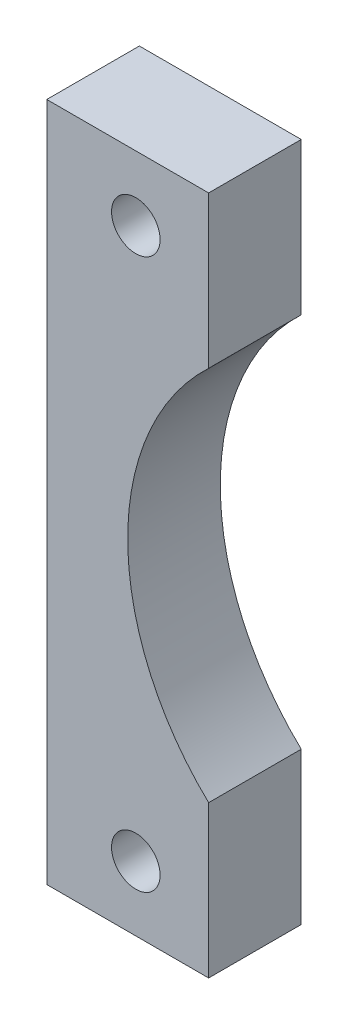
ISO-10303-21;
HEADER;
FILE_DESCRIPTION(('STEP AP214'),'2;1');
FILE_NAME('part.step','',(''),(''),'','','');
FILE_SCHEMA(('AUTOMOTIVE_DESIGN { 1 0 10303 214 1 1 1 1 }'));
ENDSEC;
DATA;
#1=APPLICATION_CONTEXT('core data for automotive mechanical design processes');
#2=APPLICATION_PROTOCOL_DEFINITION('international standard','automotive_design',2000,#1);
#3=PRODUCT_CONTEXT('',#1,'mechanical');
#4=PRODUCT('Part','Part','',(#3));
#5=PRODUCT_RELATED_PRODUCT_CATEGORY('part','',(#4));
#6=PRODUCT_DEFINITION_FORMATION('','',#4);
#7=PRODUCT_DEFINITION_CONTEXT('part definition',#1,'design');
#8=PRODUCT_DEFINITION('design','',#6,#7);
#9=PRODUCT_DEFINITION_SHAPE('','',#8);
#10=(LENGTH_UNIT() NAMED_UNIT(*) SI_UNIT(.MILLI.,.METRE.));
#11=(NAMED_UNIT(*) PLANE_ANGLE_UNIT() SI_UNIT($,.RADIAN.));
#12=(NAMED_UNIT(*) SI_UNIT($,.STERADIAN.) SOLID_ANGLE_UNIT());
#13=UNCERTAINTY_MEASURE_WITH_UNIT(LENGTH_MEASURE(1.E-05),#10,'distance_accuracy_value','');
#14=(GEOMETRIC_REPRESENTATION_CONTEXT(3) GLOBAL_UNCERTAINTY_ASSIGNED_CONTEXT((#13)) GLOBAL_UNIT_ASSIGNED_CONTEXT((#10,
#11,#12)) REPRESENTATION_CONTEXT('',''));
#15=CARTESIAN_POINT('',(0.,0.,0.));
#16=DIRECTION('',(0.,0.,1.));
#17=DIRECTION('',(1.,0.,0.));
#18=AXIS2_PLACEMENT_3D('',#15,#16,#17);
#19=CARTESIAN_POINT('',(21.,-21.,5.72));
#20=DIRECTION('',(0.,0.,1.));
#21=DIRECTION('',(1.,0.,0.));
#22=AXIS2_PLACEMENT_3D('',#19,#20,#21);
#23=PLANE('',#22);
#24=CARTESIAN_POINT('',(5.50000000000001,-38.,5.72));
#25=DIRECTION('',(0.,0.,1.));
#26=DIRECTION('',(1.,0.,0.));
#27=AXIS2_PLACEMENT_3D('',#24,#25,#26);
#28=CIRCLE('',#27,1.5);
#29=CARTESIAN_POINT('',(7.00000000000001,-38.,5.72));
#30=VERTEX_POINT('',#29);
#31=EDGE_CURVE('E122',#30,#30,#28,.T.);
#32=ORIENTED_EDGE('',*,*,#31,.F.);
#33=EDGE_LOOP('',(#32));
#34=FACE_BOUND('',#33,.T.);
#35=DIRECTION('',(0.,-1.,0.));
#36=VECTOR('',#35,1.);
#37=CARTESIAN_POINT('',(0.,0.,5.72));
#38=LINE('',#37,#36);
#39=CARTESIAN_POINT('',(0.,0.,5.72));
#40=VERTEX_POINT('',#39);
#41=CARTESIAN_POINT('',(0.,-42.,5.72));
#42=VERTEX_POINT('',#41);
#43=EDGE_CURVE('E129',#40,#42,#38,.T.);
#44=ORIENTED_EDGE('',*,*,#43,.T.);
#45=DIRECTION('',(1.,0.,0.));
#46=VECTOR('',#45,1.);
#47=CARTESIAN_POINT('',(0.,-42.,5.72));
#48=LINE('',#47,#46);
#49=CARTESIAN_POINT('',(10.,-42.,5.72));
#50=VERTEX_POINT('',#49);
#51=EDGE_CURVE('E87',#42,#50,#48,.T.);
#52=ORIENTED_EDGE('',*,*,#51,.T.);
#53=DIRECTION('',(0.,1.,0.));
#54=VECTOR('',#53,1.);
#55=CARTESIAN_POINT('',(10.,-42.,5.72));
#56=LINE('',#55,#54);
#57=CARTESIAN_POINT('',(10.,-32.6189500386223,5.72));
#58=VERTEX_POINT('',#57);
#59=EDGE_CURVE('E100',#50,#58,#56,.T.);
#60=ORIENTED_EDGE('',*,*,#59,.T.);
#61=CARTESIAN_POINT('',(21.,-21.,5.72));
#62=DIRECTION('',(0.,0.,-1.));
#63=DIRECTION('',(1.,0.,0.));
#64=AXIS2_PLACEMENT_3D('',#61,#62,#63);
#65=CIRCLE('',#64,16.);
#66=CARTESIAN_POINT('',(10.,-9.38104996137775,5.72));
#67=VERTEX_POINT('',#66);
#68=EDGE_CURVE('E94',#58,#67,#65,.T.);
#69=ORIENTED_EDGE('',*,*,#68,.T.);
#70=DIRECTION('',(0.,1.,0.));
#71=VECTOR('',#70,1.);
#72=CARTESIAN_POINT('',(10.,0.,5.72));
#73=LINE('',#72,#71);
#74=CARTESIAN_POINT('',(10.,0.,5.72));
#75=VERTEX_POINT('',#74);
#76=EDGE_CURVE('E98',#67,#75,#73,.T.);
#77=ORIENTED_EDGE('',*,*,#76,.T.);
#78=DIRECTION('',(-1.,0.,0.));
#79=VECTOR('',#78,1.);
#80=CARTESIAN_POINT('',(0.,0.,5.72));
#81=LINE('',#80,#79);
#82=EDGE_CURVE('E50',#75,#40,#81,.T.);
#83=ORIENTED_EDGE('',*,*,#82,.T.);
#84=EDGE_LOOP('',(#44,#52,#60,#69,#77,#83));
#85=FACE_BOUND('',#84,.T.);
#86=CARTESIAN_POINT('',(5.5,-4.,5.72));
#87=DIRECTION('',(0.,0.,1.));
#88=DIRECTION('',(1.,0.,0.));
#89=AXIS2_PLACEMENT_3D('',#86,#87,#88);
#90=CIRCLE('',#89,1.5);
#91=CARTESIAN_POINT('',(7.,-4.,5.72));
#92=VERTEX_POINT('',#91);
#93=EDGE_CURVE('E171',#92,#92,#90,.T.);
#94=ORIENTED_EDGE('',*,*,#93,.F.);
#95=EDGE_LOOP('',(#94));
#96=FACE_BOUND('',#95,.T.);
#97=ADVANCED_FACE('F33',(#34,#85,#96),#23,.T.);
#98=CARTESIAN_POINT('',(21.,-21.,0.));
#99=DIRECTION('',(0.,0.,1.));
#100=DIRECTION('',(1.,0.,0.));
#101=AXIS2_PLACEMENT_3D('',#98,#99,#100);
#102=PLANE('',#101);
#103=DIRECTION('',(0.,-1.,0.));
#104=VECTOR('',#103,1.);
#105=CARTESIAN_POINT('',(0.,0.,0.));
#106=LINE('',#105,#104);
#107=CARTESIAN_POINT('',(0.,0.,0.));
#108=VERTEX_POINT('',#107);
#109=CARTESIAN_POINT('',(0.,-42.,0.));
#110=VERTEX_POINT('',#109);
#111=EDGE_CURVE('E118',#108,#110,#106,.T.);
#112=ORIENTED_EDGE('',*,*,#111,.F.);
#113=DIRECTION('',(-1.,0.,0.));
#114=VECTOR('',#113,1.);
#115=CARTESIAN_POINT('',(0.,0.,0.));
#116=LINE('',#115,#114);
#117=CARTESIAN_POINT('',(10.,0.,0.));
#118=VERTEX_POINT('',#117);
#119=EDGE_CURVE('E79',#118,#108,#116,.T.);
#120=ORIENTED_EDGE('',*,*,#119,.F.);
#121=DIRECTION('',(0.,1.,0.));
#122=VECTOR('',#121,1.);
#123=CARTESIAN_POINT('',(10.,0.,0.));
#124=LINE('',#123,#122);
#125=CARTESIAN_POINT('',(10.,-9.38104996137775,0.));
#126=VERTEX_POINT('',#125);
#127=EDGE_CURVE('E73',#126,#118,#124,.T.);
#128=ORIENTED_EDGE('',*,*,#127,.F.);
#129=CARTESIAN_POINT('',(21.,-21.,0.));
#130=DIRECTION('',(0.,0.,-1.));
#131=DIRECTION('',(1.,0.,0.));
#132=AXIS2_PLACEMENT_3D('',#129,#130,#131);
#133=CIRCLE('',#132,16.);
#134=CARTESIAN_POINT('',(10.,-32.6189500386223,0.));
#135=VERTEX_POINT('',#134);
#136=EDGE_CURVE('E108',#135,#126,#133,.T.);
#137=ORIENTED_EDGE('',*,*,#136,.F.);
#138=DIRECTION('',(0.,1.,0.));
#139=VECTOR('',#138,1.);
#140=CARTESIAN_POINT('',(10.,-42.,0.));
#141=LINE('',#140,#139);
#142=CARTESIAN_POINT('',(10.,-42.,0.));
#143=VERTEX_POINT('',#142);
#144=EDGE_CURVE('E124',#143,#135,#141,.T.);
#145=ORIENTED_EDGE('',*,*,#144,.F.);
#146=DIRECTION('',(1.,0.,0.));
#147=VECTOR('',#146,1.);
#148=CARTESIAN_POINT('',(0.,-42.,0.));
#149=LINE('',#148,#147);
#150=EDGE_CURVE('E121',#110,#143,#149,.T.);
#151=ORIENTED_EDGE('',*,*,#150,.F.);
#152=EDGE_LOOP('',(#112,#120,#128,#137,#145,#151));
#153=FACE_BOUND('',#152,.T.);
#154=CARTESIAN_POINT('',(5.50000000000001,-38.,0.));
#155=DIRECTION('',(0.,0.,1.));
#156=DIRECTION('',(1.,0.,0.));
#157=AXIS2_PLACEMENT_3D('',#154,#155,#156);
#158=CIRCLE('',#157,1.5);
#159=CARTESIAN_POINT('',(7.00000000000001,-38.,0.));
#160=VERTEX_POINT('',#159);
#161=EDGE_CURVE('E177',#160,#160,#158,.T.);
#162=ORIENTED_EDGE('',*,*,#161,.T.);
#163=EDGE_LOOP('',(#162));
#164=FACE_BOUND('',#163,.T.);
#165=CARTESIAN_POINT('',(5.5,-4.,0.));
#166=DIRECTION('',(0.,0.,1.));
#167=DIRECTION('',(1.,0.,0.));
#168=AXIS2_PLACEMENT_3D('',#165,#166,#167);
#169=CIRCLE('',#168,1.5);
#170=CARTESIAN_POINT('',(7.,-4.,0.));
#171=VERTEX_POINT('',#170);
#172=EDGE_CURVE('E174',#171,#171,#169,.T.);
#173=ORIENTED_EDGE('',*,*,#172,.T.);
#174=EDGE_LOOP('',(#173));
#175=FACE_BOUND('',#174,.T.);
#176=ADVANCED_FACE('F138',(#153,#164,#175),#102,.F.);
#177=CARTESIAN_POINT('',(0.,0.,5.72));
#178=DIRECTION('',(1.,0.,0.));
#179=DIRECTION('',(0.,1.,0.));
#180=AXIS2_PLACEMENT_3D('',#177,#178,#179);
#181=PLANE('',#180);
#182=ORIENTED_EDGE('',*,*,#111,.T.);
#183=DIRECTION('',(0.,0.,-1.));
#184=VECTOR('',#183,1.);
#185=CARTESIAN_POINT('',(0.,-42.,5.72));
#186=LINE('',#185,#184);
#187=EDGE_CURVE('E11',#42,#110,#186,.T.);
#188=ORIENTED_EDGE('',*,*,#187,.F.);
#189=ORIENTED_EDGE('',*,*,#43,.F.);
#190=DIRECTION('',(0.,0.,-1.));
#191=VECTOR('',#190,1.);
#192=CARTESIAN_POINT('',(0.,0.,5.72));
#193=LINE('',#192,#191);
#194=EDGE_CURVE('E114',#40,#108,#193,.T.);
#195=ORIENTED_EDGE('',*,*,#194,.T.);
#196=EDGE_LOOP('',(#182,#188,#189,#195));
#197=FACE_BOUND('',#196,.T.);
#198=ADVANCED_FACE('F35',(#197),#181,.F.);
#199=CARTESIAN_POINT('',(0.,-42.,5.72));
#200=DIRECTION('',(0.,1.,0.));
#201=DIRECTION('',(0.,0.,1.));
#202=AXIS2_PLACEMENT_3D('',#199,#200,#201);
#203=PLANE('',#202);
#204=ORIENTED_EDGE('',*,*,#150,.T.);
#205=DIRECTION('',(0.,0.,-1.));
#206=VECTOR('',#205,1.);
#207=CARTESIAN_POINT('',(10.,-42.,5.72));
#208=LINE('',#207,#206);
#209=EDGE_CURVE('E42',#50,#143,#208,.T.);
#210=ORIENTED_EDGE('',*,*,#209,.F.);
#211=ORIENTED_EDGE('',*,*,#51,.F.);
#212=ORIENTED_EDGE('',*,*,#187,.T.);
#213=EDGE_LOOP('',(#204,#210,#211,#212));
#214=FACE_BOUND('',#213,.T.);
#215=ADVANCED_FACE('F218',(#214),#203,.F.);
#216=CARTESIAN_POINT('',(10.,-42.,5.72));
#217=DIRECTION('',(-1.,0.,0.));
#218=DIRECTION('',(0.,0.,1.));
#219=AXIS2_PLACEMENT_3D('',#216,#217,#218);
#220=PLANE('',#219);
#221=ORIENTED_EDGE('',*,*,#144,.T.);
#222=DIRECTION('',(0.,0.,-1.));
#223=VECTOR('',#222,1.);
#224=CARTESIAN_POINT('',(10.,-32.6189500386223,5.72));
#225=LINE('',#224,#223);
#226=EDGE_CURVE('E109',#58,#135,#225,.T.);
#227=ORIENTED_EDGE('',*,*,#226,.F.);
#228=ORIENTED_EDGE('',*,*,#59,.F.);
#229=ORIENTED_EDGE('',*,*,#209,.T.);
#230=EDGE_LOOP('',(#221,#227,#228,#229));
#231=FACE_BOUND('',#230,.T.);
#232=ADVANCED_FACE('F135',(#231),#220,.F.);
#233=CARTESIAN_POINT('',(21.,-21.,5.72));
#234=DIRECTION('',(0.,0.,-1.));
#235=DIRECTION('',(-1.,0.,0.));
#236=AXIS2_PLACEMENT_3D('',#233,#234,#235);
#237=CYLINDRICAL_SURFACE('',#236,16.);
#238=ORIENTED_EDGE('',*,*,#136,.T.);
#239=DIRECTION('',(0.,0.,-1.));
#240=VECTOR('',#239,1.);
#241=CARTESIAN_POINT('',(10.,-9.38104996137775,5.72));
#242=LINE('',#241,#240);
#243=EDGE_CURVE('E105',#67,#126,#242,.T.);
#244=ORIENTED_EDGE('',*,*,#243,.F.);
#245=ORIENTED_EDGE('',*,*,#68,.F.);
#246=ORIENTED_EDGE('',*,*,#226,.T.);
#247=EDGE_LOOP('',(#238,#244,#245,#246));
#248=FACE_BOUND('',#247,.T.);
#249=ADVANCED_FACE('F106',(#248),#237,.F.);
#250=CARTESIAN_POINT('',(10.,0.,5.72));
#251=DIRECTION('',(-1.,0.,0.));
#252=DIRECTION('',(0.,0.,1.));
#253=AXIS2_PLACEMENT_3D('',#250,#251,#252);
#254=PLANE('',#253);
#255=ORIENTED_EDGE('',*,*,#127,.T.);
#256=DIRECTION('',(0.,0.,-1.));
#257=VECTOR('',#256,1.);
#258=CARTESIAN_POINT('',(10.,0.,5.72));
#259=LINE('',#258,#257);
#260=EDGE_CURVE('E110',#75,#118,#259,.T.);
#261=ORIENTED_EDGE('',*,*,#260,.F.);
#262=ORIENTED_EDGE('',*,*,#76,.F.);
#263=ORIENTED_EDGE('',*,*,#243,.T.);
#264=EDGE_LOOP('',(#255,#261,#262,#263));
#265=FACE_BOUND('',#264,.T.);
#266=ADVANCED_FACE('F112',(#265),#254,.F.);
#267=CARTESIAN_POINT('',(0.,0.,5.72));
#268=DIRECTION('',(0.,-1.,0.));
#269=DIRECTION('',(0.,0.,-1.));
#270=AXIS2_PLACEMENT_3D('',#267,#268,#269);
#271=PLANE('',#270);
#272=ORIENTED_EDGE('',*,*,#119,.T.);
#273=ORIENTED_EDGE('',*,*,#194,.F.);
#274=ORIENTED_EDGE('',*,*,#82,.F.);
#275=ORIENTED_EDGE('',*,*,#260,.T.);
#276=EDGE_LOOP('',(#272,#273,#274,#275));
#277=FACE_BOUND('',#276,.T.);
#278=ADVANCED_FACE('F143',(#277),#271,.F.);
#279=CARTESIAN_POINT('',(5.50000000000001,-38.,5.72));
#280=DIRECTION('',(0.,0.,-1.));
#281=DIRECTION('',(-1.,0.,0.));
#282=AXIS2_PLACEMENT_3D('',#279,#280,#281);
#283=CYLINDRICAL_SURFACE('',#282,1.5);
#284=ORIENTED_EDGE('',*,*,#31,.T.);
#285=EDGE_LOOP('',(#284));
#286=FACE_BOUND('',#285,.T.);
#287=ORIENTED_EDGE('',*,*,#161,.F.);
#288=EDGE_LOOP('',(#287));
#289=FACE_BOUND('',#288,.T.);
#290=ADVANCED_FACE('F145',(#286,#289),#283,.F.);
#291=CARTESIAN_POINT('',(5.5,-4.,5.72));
#292=DIRECTION('',(0.,0.,-1.));
#293=DIRECTION('',(-1.,0.,0.));
#294=AXIS2_PLACEMENT_3D('',#291,#292,#293);
#295=CYLINDRICAL_SURFACE('',#294,1.5);
#296=ORIENTED_EDGE('',*,*,#93,.T.);
#297=EDGE_LOOP('',(#296));
#298=FACE_BOUND('',#297,.T.);
#299=ORIENTED_EDGE('',*,*,#172,.F.);
#300=EDGE_LOOP('',(#299));
#301=FACE_BOUND('',#300,.T.);
#302=ADVANCED_FACE('F151',(#298,#301),#295,.F.);
#303=CLOSED_SHELL('',(#97,#176,#198,#215,#232,#249,#266,#278,#290,#302));
#304=MANIFOLD_SOLID_BREP('B2',#303);
#305=ADVANCED_BREP_SHAPE_REPRESENTATION('',(#18,#304),#14);
#306=SHAPE_DEFINITION_REPRESENTATION(#9,#305);
ENDSEC;
END-ISO-10303-21;
